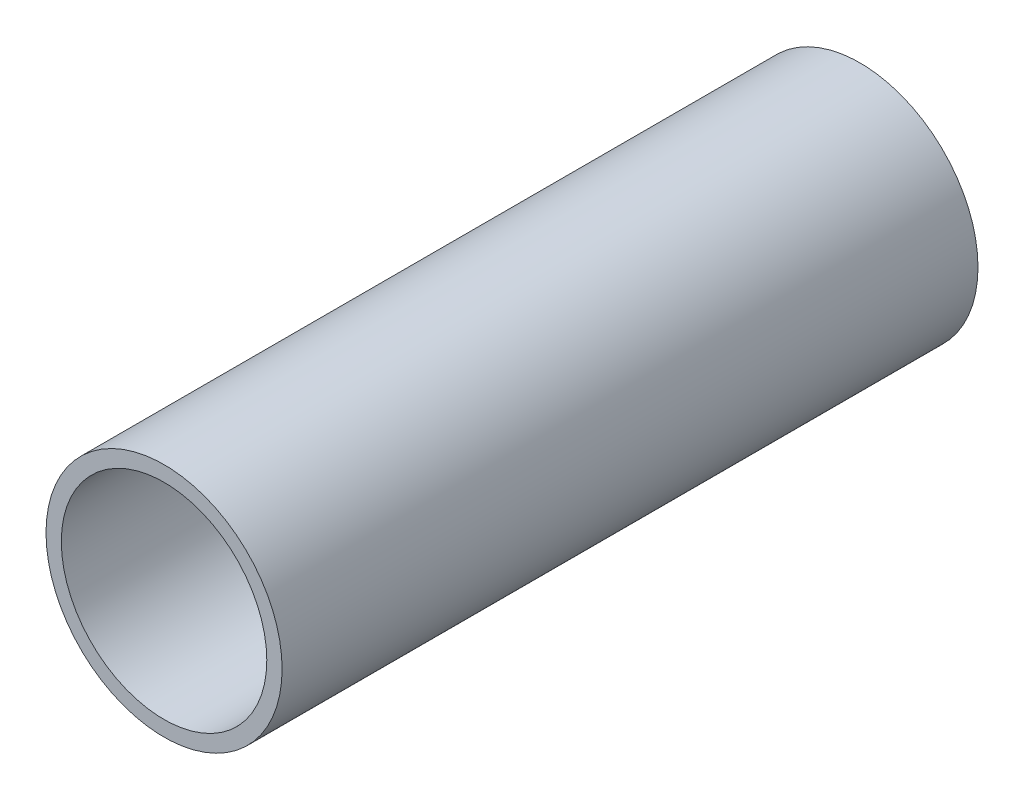
ISO-10303-21;
HEADER;
FILE_DESCRIPTION(('STEP AP214'),'2;1');
FILE_NAME('part.step','',(''),(''),'','','');
FILE_SCHEMA(('AUTOMOTIVE_DESIGN { 1 0 10303 214 1 1 1 1 }'));
ENDSEC;
DATA;
#1=APPLICATION_CONTEXT('core data for automotive mechanical design processes');
#2=APPLICATION_PROTOCOL_DEFINITION('international standard','automotive_design',2000,#1);
#3=PRODUCT_CONTEXT('',#1,'mechanical');
#4=PRODUCT('Part','Part','',(#3));
#5=PRODUCT_RELATED_PRODUCT_CATEGORY('part','',(#4));
#6=PRODUCT_DEFINITION_FORMATION('','',#4);
#7=PRODUCT_DEFINITION_CONTEXT('part definition',#1,'design');
#8=PRODUCT_DEFINITION('design','',#6,#7);
#9=PRODUCT_DEFINITION_SHAPE('','',#8);
#10=(LENGTH_UNIT() NAMED_UNIT(*) SI_UNIT(.MILLI.,.METRE.));
#11=(NAMED_UNIT(*) PLANE_ANGLE_UNIT() SI_UNIT($,.RADIAN.));
#12=(NAMED_UNIT(*) SI_UNIT($,.STERADIAN.) SOLID_ANGLE_UNIT());
#13=UNCERTAINTY_MEASURE_WITH_UNIT(LENGTH_MEASURE(1.E-05),#10,'distance_accuracy_value','');
#14=(GEOMETRIC_REPRESENTATION_CONTEXT(3) GLOBAL_UNCERTAINTY_ASSIGNED_CONTEXT((#13)) GLOBAL_UNIT_ASSIGNED_CONTEXT((#10,
#11,#12)) REPRESENTATION_CONTEXT('',''));
#15=CARTESIAN_POINT('',(0.,0.,0.));
#16=DIRECTION('',(0.,0.,1.));
#17=DIRECTION('',(1.,0.,0.));
#18=AXIS2_PLACEMENT_3D('',#15,#16,#17);
#19=CARTESIAN_POINT('',(0.,0.,177.8));
#20=DIRECTION('',(0.,0.,1.));
#21=DIRECTION('',(1.,0.,0.));
#22=AXIS2_PLACEMENT_3D('',#19,#20,#21);
#23=PLANE('',#22);
#24=CARTESIAN_POINT('',(0.,0.,177.8));
#25=DIRECTION('',(0.,0.,1.));
#26=DIRECTION('',(1.,0.,0.));
#27=AXIS2_PLACEMENT_3D('',#24,#25,#26);
#28=CIRCLE('',#27,30.1625);
#29=CARTESIAN_POINT('',(30.1625,0.,177.8));
#30=VERTEX_POINT('',#29);
#31=EDGE_CURVE('E10',#30,#30,#28,.T.);
#32=ORIENTED_EDGE('',*,*,#31,.T.);
#33=EDGE_LOOP('',(#32));
#34=FACE_BOUND('',#33,.T.);
#35=CARTESIAN_POINT('',(0.,0.,177.8));
#36=DIRECTION('',(0.,0.,1.));
#37=DIRECTION('',(1.,0.,0.));
#38=AXIS2_PLACEMENT_3D('',#35,#36,#37);
#39=CIRCLE('',#38,26.2509);
#40=CARTESIAN_POINT('',(26.2509,0.,177.8));
#41=VERTEX_POINT('',#40);
#42=EDGE_CURVE('E54',#41,#41,#39,.T.);
#43=ORIENTED_EDGE('',*,*,#42,.F.);
#44=EDGE_LOOP('',(#43));
#45=FACE_BOUND('',#44,.T.);
#46=ADVANCED_FACE('F41',(#34,#45),#23,.T.);
#47=CARTESIAN_POINT('',(0.,0.,0.));
#48=DIRECTION('',(0.,0.,1.));
#49=DIRECTION('',(1.,0.,0.));
#50=AXIS2_PLACEMENT_3D('',#47,#48,#49);
#51=PLANE('',#50);
#52=CARTESIAN_POINT('',(0.,0.,0.));
#53=DIRECTION('',(0.,0.,1.));
#54=DIRECTION('',(1.,0.,0.));
#55=AXIS2_PLACEMENT_3D('',#52,#53,#54);
#56=CIRCLE('',#55,30.1625);
#57=CARTESIAN_POINT('',(30.1625,0.,0.));
#58=VERTEX_POINT('',#57);
#59=EDGE_CURVE('E45',#58,#58,#56,.T.);
#60=ORIENTED_EDGE('',*,*,#59,.F.);
#61=EDGE_LOOP('',(#60));
#62=FACE_BOUND('',#61,.T.);
#63=CARTESIAN_POINT('',(0.,0.,0.));
#64=DIRECTION('',(0.,0.,1.));
#65=DIRECTION('',(1.,0.,0.));
#66=AXIS2_PLACEMENT_3D('',#63,#64,#65);
#67=CIRCLE('',#66,26.2509);
#68=CARTESIAN_POINT('',(26.2509,0.,0.));
#69=VERTEX_POINT('',#68);
#70=EDGE_CURVE('E56',#69,#69,#67,.T.);
#71=ORIENTED_EDGE('',*,*,#70,.T.);
#72=EDGE_LOOP('',(#71));
#73=FACE_BOUND('',#72,.T.);
#74=ADVANCED_FACE('F68',(#62,#73),#51,.F.);
#75=CARTESIAN_POINT('',(0.,0.,177.8));
#76=DIRECTION('',(0.,0.,-1.));
#77=DIRECTION('',(-1.,0.,0.));
#78=AXIS2_PLACEMENT_3D('',#75,#76,#77);
#79=CYLINDRICAL_SURFACE('',#78,30.1625);
#80=ORIENTED_EDGE('',*,*,#31,.F.);
#81=EDGE_LOOP('',(#80));
#82=FACE_BOUND('',#81,.T.);
#83=ORIENTED_EDGE('',*,*,#59,.T.);
#84=EDGE_LOOP('',(#83));
#85=FACE_BOUND('',#84,.T.);
#86=ADVANCED_FACE('F43',(#82,#85),#79,.T.);
#87=CARTESIAN_POINT('',(0.,0.,177.8));
#88=DIRECTION('',(0.,0.,-1.));
#89=DIRECTION('',(-1.,0.,0.));
#90=AXIS2_PLACEMENT_3D('',#87,#88,#89);
#91=CYLINDRICAL_SURFACE('',#90,26.2509);
#92=ORIENTED_EDGE('',*,*,#42,.T.);
#93=EDGE_LOOP('',(#92));
#94=FACE_BOUND('',#93,.T.);
#95=ORIENTED_EDGE('',*,*,#70,.F.);
#96=EDGE_LOOP('',(#95));
#97=FACE_BOUND('',#96,.T.);
#98=ADVANCED_FACE('F64',(#94,#97),#91,.F.);
#99=CLOSED_SHELL('',(#46,#74,#86,#98));
#100=MANIFOLD_SOLID_BREP('B2',#99);
#101=ADVANCED_BREP_SHAPE_REPRESENTATION('',(#18,#100),#14);
#102=SHAPE_DEFINITION_REPRESENTATION(#9,#101);
ENDSEC;
END-ISO-10303-21;
